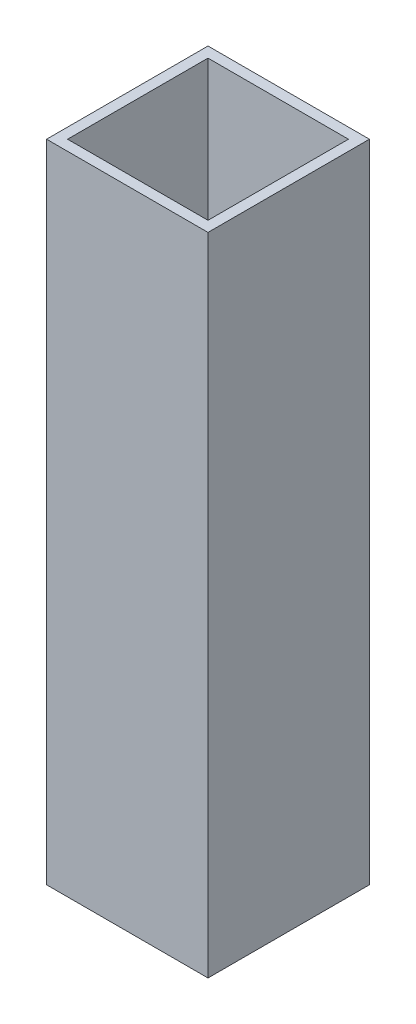
ISO-10303-21;
HEADER;
FILE_DESCRIPTION(('STEP AP214'),'2;1');
FILE_NAME('part.step','',(''),(''),'','','');
FILE_SCHEMA(('AUTOMOTIVE_DESIGN { 1 0 10303 214 1 1 1 1 }'));
ENDSEC;
DATA;
#1=APPLICATION_CONTEXT('core data for automotive mechanical design processes');
#2=APPLICATION_PROTOCOL_DEFINITION('international standard','automotive_design',2000,#1);
#3=PRODUCT_CONTEXT('',#1,'mechanical');
#4=PRODUCT('Part','Part','',(#3));
#5=PRODUCT_RELATED_PRODUCT_CATEGORY('part','',(#4));
#6=PRODUCT_DEFINITION_FORMATION('','',#4);
#7=PRODUCT_DEFINITION_CONTEXT('part definition',#1,'design');
#8=PRODUCT_DEFINITION('design','',#6,#7);
#9=PRODUCT_DEFINITION_SHAPE('','',#8);
#10=(LENGTH_UNIT() NAMED_UNIT(*) SI_UNIT(.MILLI.,.METRE.));
#11=(NAMED_UNIT(*) PLANE_ANGLE_UNIT() SI_UNIT($,.RADIAN.));
#12=(NAMED_UNIT(*) SI_UNIT($,.STERADIAN.) SOLID_ANGLE_UNIT());
#13=UNCERTAINTY_MEASURE_WITH_UNIT(LENGTH_MEASURE(1.E-05),#10,'distance_accuracy_value','');
#14=(GEOMETRIC_REPRESENTATION_CONTEXT(3) GLOBAL_UNCERTAINTY_ASSIGNED_CONTEXT((#13)) GLOBAL_UNIT_ASSIGNED_CONTEXT((#10,
#11,#12)) REPRESENTATION_CONTEXT('',''));
#15=CARTESIAN_POINT('',(0.,0.,0.));
#16=DIRECTION('',(0.,0.,1.));
#17=DIRECTION('',(1.,0.,0.));
#18=AXIS2_PLACEMENT_3D('',#15,#16,#17);
#19=CARTESIAN_POINT('',(0.,101.6,0.));
#20=DIRECTION('',(1.,0.,0.));
#21=DIRECTION('',(0.,0.,-1.));
#22=AXIS2_PLACEMENT_3D('',#19,#20,#21);
#23=PLANE('',#22);
#24=DIRECTION('',(0.,0.,1.));
#25=VECTOR('',#24,1.);
#26=CARTESIAN_POINT('',(0.,0.,0.));
#27=LINE('',#26,#25);
#28=CARTESIAN_POINT('',(0.,0.,0.));
#29=VERTEX_POINT('',#28);
#30=CARTESIAN_POINT('',(0.,0.,25.4));
#31=VERTEX_POINT('',#30);
#32=EDGE_CURVE('E130',#29,#31,#27,.T.);
#33=ORIENTED_EDGE('',*,*,#32,.T.);
#34=DIRECTION('',(0.,-1.,0.));
#35=VECTOR('',#34,1.);
#36=CARTESIAN_POINT('',(0.,101.6,25.4));
#37=LINE('',#36,#35);
#38=CARTESIAN_POINT('',(0.,101.6,25.4));
#39=VERTEX_POINT('',#38);
#40=EDGE_CURVE('E11',#39,#31,#37,.T.);
#41=ORIENTED_EDGE('',*,*,#40,.F.);
#42=DIRECTION('',(0.,0.,1.));
#43=VECTOR('',#42,1.);
#44=CARTESIAN_POINT('',(0.,101.6,0.));
#45=LINE('',#44,#43);
#46=CARTESIAN_POINT('',(0.,101.6,0.));
#47=VERTEX_POINT('',#46);
#48=EDGE_CURVE('E134',#47,#39,#45,.T.);
#49=ORIENTED_EDGE('',*,*,#48,.F.);
#50=DIRECTION('',(0.,-1.,0.));
#51=VECTOR('',#50,1.);
#52=CARTESIAN_POINT('',(0.,101.6,0.));
#53=LINE('',#52,#51);
#54=EDGE_CURVE('E144',#47,#29,#53,.T.);
#55=ORIENTED_EDGE('',*,*,#54,.T.);
#56=EDGE_LOOP('',(#33,#41,#49,#55));
#57=FACE_BOUND('',#56,.T.);
#58=ADVANCED_FACE('F33',(#57),#23,.F.);
#59=CARTESIAN_POINT('',(0.,101.6,25.4));
#60=DIRECTION('',(0.,0.,-1.));
#61=DIRECTION('',(-1.,0.,0.));
#62=AXIS2_PLACEMENT_3D('',#59,#60,#61);
#63=PLANE('',#62);
#64=DIRECTION('',(1.,0.,0.));
#65=VECTOR('',#64,1.);
#66=CARTESIAN_POINT('',(0.,0.,25.4));
#67=LINE('',#66,#65);
#68=CARTESIAN_POINT('',(25.4,0.,25.4));
#69=VERTEX_POINT('',#68);
#70=EDGE_CURVE('E147',#31,#69,#67,.T.);
#71=ORIENTED_EDGE('',*,*,#70,.T.);
#72=DIRECTION('',(0.,-1.,0.));
#73=VECTOR('',#72,1.);
#74=CARTESIAN_POINT('',(25.4,101.6,25.4));
#75=LINE('',#74,#73);
#76=CARTESIAN_POINT('',(25.4,101.6,25.4));
#77=VERTEX_POINT('',#76);
#78=EDGE_CURVE('E40',#77,#69,#75,.T.);
#79=ORIENTED_EDGE('',*,*,#78,.F.);
#80=DIRECTION('',(1.,0.,0.));
#81=VECTOR('',#80,1.);
#82=CARTESIAN_POINT('',(0.,101.6,25.4));
#83=LINE('',#82,#81);
#84=EDGE_CURVE('E137',#39,#77,#83,.T.);
#85=ORIENTED_EDGE('',*,*,#84,.F.);
#86=ORIENTED_EDGE('',*,*,#40,.T.);
#87=EDGE_LOOP('',(#71,#79,#85,#86));
#88=FACE_BOUND('',#87,.T.);
#89=ADVANCED_FACE('F175',(#88),#63,.F.);
#90=CARTESIAN_POINT('',(25.4,101.6,0.));
#91=DIRECTION('',(-1.,0.,0.));
#92=DIRECTION('',(0.,0.,1.));
#93=AXIS2_PLACEMENT_3D('',#90,#91,#92);
#94=PLANE('',#93);
#95=DIRECTION('',(0.,0.,-1.));
#96=VECTOR('',#95,1.);
#97=CARTESIAN_POINT('',(25.4,0.,0.));
#98=LINE('',#97,#96);
#99=CARTESIAN_POINT('',(25.4,0.,0.));
#100=VERTEX_POINT('',#99);
#101=EDGE_CURVE('E149',#69,#100,#98,.T.);
#102=ORIENTED_EDGE('',*,*,#101,.T.);
#103=DIRECTION('',(0.,-1.,0.));
#104=VECTOR('',#103,1.);
#105=CARTESIAN_POINT('',(25.4,101.6,0.));
#106=LINE('',#105,#104);
#107=CARTESIAN_POINT('',(25.4,101.6,0.));
#108=VERTEX_POINT('',#107);
#109=EDGE_CURVE('E154',#108,#100,#106,.T.);
#110=ORIENTED_EDGE('',*,*,#109,.F.);
#111=DIRECTION('',(0.,0.,-1.));
#112=VECTOR('',#111,1.);
#113=CARTESIAN_POINT('',(25.4,101.6,0.));
#114=LINE('',#113,#112);
#115=EDGE_CURVE('E140',#77,#108,#114,.T.);
#116=ORIENTED_EDGE('',*,*,#115,.F.);
#117=ORIENTED_EDGE('',*,*,#78,.T.);
#118=EDGE_LOOP('',(#102,#110,#116,#117));
#119=FACE_BOUND('',#118,.T.);
#120=ADVANCED_FACE('F161',(#119),#94,.F.);
#121=CARTESIAN_POINT('',(0.,101.6,0.));
#122=DIRECTION('',(0.,0.,1.));
#123=DIRECTION('',(1.,0.,0.));
#124=AXIS2_PLACEMENT_3D('',#121,#122,#123);
#125=PLANE('',#124);
#126=DIRECTION('',(-1.,0.,0.));
#127=VECTOR('',#126,1.);
#128=CARTESIAN_POINT('',(0.,0.,0.));
#129=LINE('',#128,#127);
#130=EDGE_CURVE('E138',#100,#29,#129,.T.);
#131=ORIENTED_EDGE('',*,*,#130,.T.);
#132=ORIENTED_EDGE('',*,*,#54,.F.);
#133=DIRECTION('',(-1.,0.,0.));
#134=VECTOR('',#133,1.);
#135=CARTESIAN_POINT('',(0.,101.6,0.));
#136=LINE('',#135,#134);
#137=EDGE_CURVE('E142',#108,#47,#136,.T.);
#138=ORIENTED_EDGE('',*,*,#137,.F.);
#139=ORIENTED_EDGE('',*,*,#109,.T.);
#140=EDGE_LOOP('',(#131,#132,#138,#139));
#141=FACE_BOUND('',#140,.T.);
#142=ADVANCED_FACE('F168',(#141),#125,.F.);
#143=CARTESIAN_POINT('',(0.,101.6,0.));
#144=DIRECTION('',(0.,1.,0.));
#145=DIRECTION('',(0.,0.,1.));
#146=AXIS2_PLACEMENT_3D('',#143,#144,#145);
#147=PLANE('',#146);
#148=DIRECTION('',(0.,0.,1.));
#149=VECTOR('',#148,1.);
#150=CARTESIAN_POINT('',(1.651,101.6,1.651));
#151=LINE('',#150,#149);
#152=CARTESIAN_POINT('',(1.651,101.6,1.651));
#153=VERTEX_POINT('',#152);
#154=CARTESIAN_POINT('',(1.651,101.6,23.749));
#155=VERTEX_POINT('',#154);
#156=EDGE_CURVE('E47',#153,#155,#151,.T.);
#157=ORIENTED_EDGE('',*,*,#156,.F.);
#158=DIRECTION('',(-1.,0.,0.));
#159=VECTOR('',#158,1.);
#160=CARTESIAN_POINT('',(1.651,101.6,1.651));
#161=LINE('',#160,#159);
#162=CARTESIAN_POINT('',(23.749,101.6,1.651));
#163=VERTEX_POINT('',#162);
#164=EDGE_CURVE('E115',#163,#153,#161,.T.);
#165=ORIENTED_EDGE('',*,*,#164,.F.);
#166=DIRECTION('',(0.,0.,-1.));
#167=VECTOR('',#166,1.);
#168=CARTESIAN_POINT('',(23.749,101.6,1.651));
#169=LINE('',#168,#167);
#170=CARTESIAN_POINT('',(23.749,101.6,23.749));
#171=VERTEX_POINT('',#170);
#172=EDGE_CURVE('E118',#171,#163,#169,.T.);
#173=ORIENTED_EDGE('',*,*,#172,.F.);
#174=DIRECTION('',(1.,0.,0.));
#175=VECTOR('',#174,1.);
#176=CARTESIAN_POINT('',(1.651,101.6,23.749));
#177=LINE('',#176,#175);
#178=EDGE_CURVE('E124',#155,#171,#177,.T.);
#179=ORIENTED_EDGE('',*,*,#178,.F.);
#180=EDGE_LOOP('',(#157,#165,#173,#179));
#181=FACE_BOUND('',#180,.T.);
#182=ORIENTED_EDGE('',*,*,#48,.T.);
#183=ORIENTED_EDGE('',*,*,#84,.T.);
#184=ORIENTED_EDGE('',*,*,#115,.T.);
#185=ORIENTED_EDGE('',*,*,#137,.T.);
#186=EDGE_LOOP('',(#182,#183,#184,#185));
#187=FACE_BOUND('',#186,.T.);
#188=ADVANCED_FACE('F174',(#181,#187),#147,.T.);
#189=CARTESIAN_POINT('',(0.,0.,0.));
#190=DIRECTION('',(0.,1.,0.));
#191=DIRECTION('',(0.,0.,1.));
#192=AXIS2_PLACEMENT_3D('',#189,#190,#191);
#193=PLANE('',#192);
#194=DIRECTION('',(-1.,0.,0.));
#195=VECTOR('',#194,1.);
#196=CARTESIAN_POINT('',(1.651,0.,1.651));
#197=LINE('',#196,#195);
#198=CARTESIAN_POINT('',(23.749,0.,1.651));
#199=VERTEX_POINT('',#198);
#200=CARTESIAN_POINT('',(1.651,0.,1.651));
#201=VERTEX_POINT('',#200);
#202=EDGE_CURVE('E105',#199,#201,#197,.T.);
#203=ORIENTED_EDGE('',*,*,#202,.T.);
#204=DIRECTION('',(0.,0.,1.));
#205=VECTOR('',#204,1.);
#206=CARTESIAN_POINT('',(1.651,0.,1.651));
#207=LINE('',#206,#205);
#208=CARTESIAN_POINT('',(1.651,0.,23.749));
#209=VERTEX_POINT('',#208);
#210=EDGE_CURVE('E99',#201,#209,#207,.T.);
#211=ORIENTED_EDGE('',*,*,#210,.T.);
#212=DIRECTION('',(1.,0.,0.));
#213=VECTOR('',#212,1.);
#214=CARTESIAN_POINT('',(1.651,0.,23.749));
#215=LINE('',#214,#213);
#216=CARTESIAN_POINT('',(23.749,0.,23.749));
#217=VERTEX_POINT('',#216);
#218=EDGE_CURVE('E108',#209,#217,#215,.T.);
#219=ORIENTED_EDGE('',*,*,#218,.T.);
#220=DIRECTION('',(0.,0.,-1.));
#221=VECTOR('',#220,1.);
#222=CARTESIAN_POINT('',(23.749,0.,1.651));
#223=LINE('',#222,#221);
#224=EDGE_CURVE('E55',#217,#199,#223,.T.);
#225=ORIENTED_EDGE('',*,*,#224,.T.);
#226=EDGE_LOOP('',(#203,#211,#219,#225));
#227=FACE_BOUND('',#226,.T.);
#228=ORIENTED_EDGE('',*,*,#32,.F.);
#229=ORIENTED_EDGE('',*,*,#130,.F.);
#230=ORIENTED_EDGE('',*,*,#101,.F.);
#231=ORIENTED_EDGE('',*,*,#70,.F.);
#232=EDGE_LOOP('',(#228,#229,#230,#231));
#233=FACE_BOUND('',#232,.T.);
#234=ADVANCED_FACE('F112',(#227,#233),#193,.F.);
#235=CARTESIAN_POINT('',(1.651,0.,1.651));
#236=DIRECTION('',(-1.,0.,0.));
#237=DIRECTION('',(0.,0.,1.));
#238=AXIS2_PLACEMENT_3D('',#235,#236,#237);
#239=PLANE('',#238);
#240=ORIENTED_EDGE('',*,*,#156,.T.);
#241=DIRECTION('',(0.,1.,0.));
#242=VECTOR('',#241,1.);
#243=CARTESIAN_POINT('',(1.651,0.,23.749));
#244=LINE('',#243,#242);
#245=EDGE_CURVE('E95',#209,#155,#244,.T.);
#246=ORIENTED_EDGE('',*,*,#245,.F.);
#247=ORIENTED_EDGE('',*,*,#210,.F.);
#248=DIRECTION('',(0.,1.,0.));
#249=VECTOR('',#248,1.);
#250=CARTESIAN_POINT('',(1.651,0.,1.651));
#251=LINE('',#250,#249);
#252=EDGE_CURVE('E128',#201,#153,#251,.T.);
#253=ORIENTED_EDGE('',*,*,#252,.T.);
#254=EDGE_LOOP('',(#240,#246,#247,#253));
#255=FACE_BOUND('',#254,.T.);
#256=ADVANCED_FACE('F97',(#255),#239,.F.);
#257=CARTESIAN_POINT('',(1.651,0.,1.651));
#258=DIRECTION('',(0.,0.,-1.));
#259=DIRECTION('',(-1.,0.,0.));
#260=AXIS2_PLACEMENT_3D('',#257,#258,#259);
#261=PLANE('',#260);
#262=ORIENTED_EDGE('',*,*,#164,.T.);
#263=ORIENTED_EDGE('',*,*,#252,.F.);
#264=ORIENTED_EDGE('',*,*,#202,.F.);
#265=DIRECTION('',(0.,1.,0.));
#266=VECTOR('',#265,1.);
#267=CARTESIAN_POINT('',(23.749,0.,1.651));
#268=LINE('',#267,#266);
#269=EDGE_CURVE('E131',#199,#163,#268,.T.);
#270=ORIENTED_EDGE('',*,*,#269,.T.);
#271=EDGE_LOOP('',(#262,#263,#264,#270));
#272=FACE_BOUND('',#271,.T.);
#273=ADVANCED_FACE('F192',(#272),#261,.F.);
#274=CARTESIAN_POINT('',(23.749,0.,1.651));
#275=DIRECTION('',(1.,0.,0.));
#276=DIRECTION('',(0.,0.,-1.));
#277=AXIS2_PLACEMENT_3D('',#274,#275,#276);
#278=PLANE('',#277);
#279=ORIENTED_EDGE('',*,*,#172,.T.);
#280=ORIENTED_EDGE('',*,*,#269,.F.);
#281=ORIENTED_EDGE('',*,*,#224,.F.);
#282=DIRECTION('',(0.,1.,0.));
#283=VECTOR('',#282,1.);
#284=CARTESIAN_POINT('',(23.749,0.,23.749));
#285=LINE('',#284,#283);
#286=EDGE_CURVE('E104',#217,#171,#285,.T.);
#287=ORIENTED_EDGE('',*,*,#286,.T.);
#288=EDGE_LOOP('',(#279,#280,#281,#287));
#289=FACE_BOUND('',#288,.T.);
#290=ADVANCED_FACE('F195',(#289),#278,.F.);
#291=CARTESIAN_POINT('',(1.651,0.,23.749));
#292=DIRECTION('',(0.,0.,1.));
#293=DIRECTION('',(1.,0.,0.));
#294=AXIS2_PLACEMENT_3D('',#291,#292,#293);
#295=PLANE('',#294);
#296=ORIENTED_EDGE('',*,*,#178,.T.);
#297=ORIENTED_EDGE('',*,*,#286,.F.);
#298=ORIENTED_EDGE('',*,*,#218,.F.);
#299=ORIENTED_EDGE('',*,*,#245,.T.);
#300=EDGE_LOOP('',(#296,#297,#298,#299));
#301=FACE_BOUND('',#300,.T.);
#302=ADVANCED_FACE('F109',(#301),#295,.F.);
#303=CLOSED_SHELL('',(#58,#89,#120,#142,#188,#234,#256,#273,#290,#302));
#304=MANIFOLD_SOLID_BREP('B2',#303);
#305=ADVANCED_BREP_SHAPE_REPRESENTATION('',(#18,#304),#14);
#306=SHAPE_DEFINITION_REPRESENTATION(#9,#305);
ENDSEC;
END-ISO-10303-21;
